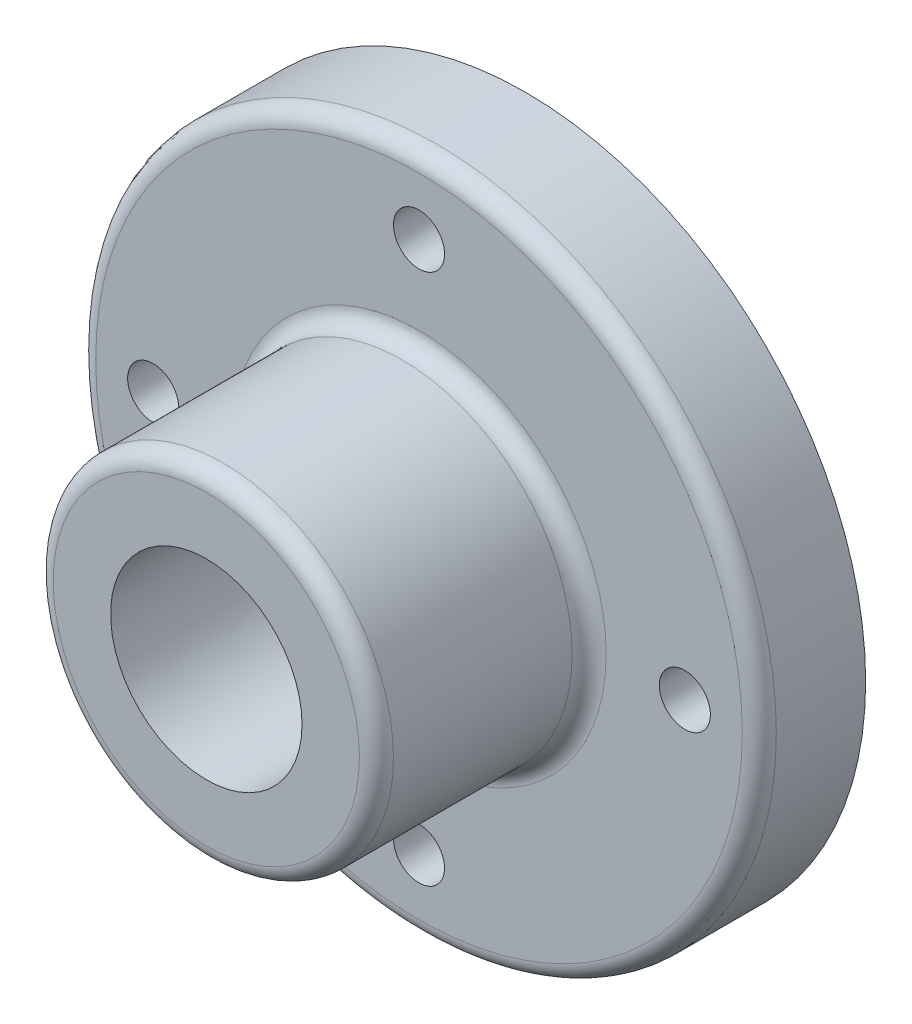
ISO-10303-21;
HEADER;
FILE_DESCRIPTION(('STEP AP214'),'2;1');
FILE_NAME('part.step','',(''),(''),'','','');
FILE_SCHEMA(('AUTOMOTIVE_DESIGN { 1 0 10303 214 1 1 1 1 }'));
ENDSEC;
DATA;
#1=APPLICATION_CONTEXT('core data for automotive mechanical design processes');
#2=APPLICATION_PROTOCOL_DEFINITION('international standard','automotive_design',2000,#1);
#3=PRODUCT_CONTEXT('',#1,'mechanical');
#4=PRODUCT('Part','Part','',(#3));
#5=PRODUCT_RELATED_PRODUCT_CATEGORY('part','',(#4));
#6=PRODUCT_DEFINITION_FORMATION('','',#4);
#7=PRODUCT_DEFINITION_CONTEXT('part definition',#1,'design');
#8=PRODUCT_DEFINITION('design','',#6,#7);
#9=PRODUCT_DEFINITION_SHAPE('','',#8);
#10=(LENGTH_UNIT() NAMED_UNIT(*) SI_UNIT(.MILLI.,.METRE.));
#11=(NAMED_UNIT(*) PLANE_ANGLE_UNIT() SI_UNIT($,.RADIAN.));
#12=(NAMED_UNIT(*) SI_UNIT($,.STERADIAN.) SOLID_ANGLE_UNIT());
#13=UNCERTAINTY_MEASURE_WITH_UNIT(LENGTH_MEASURE(1.E-05),#10,'distance_accuracy_value','');
#14=(GEOMETRIC_REPRESENTATION_CONTEXT(3) GLOBAL_UNCERTAINTY_ASSIGNED_CONTEXT((#13)) GLOBAL_UNIT_ASSIGNED_CONTEXT((#10,
#11,#12)) REPRESENTATION_CONTEXT('',''));
#15=CARTESIAN_POINT('',(0.,0.,0.));
#16=DIRECTION('',(0.,0.,1.));
#17=DIRECTION('',(1.,0.,0.));
#18=AXIS2_PLACEMENT_3D('',#15,#16,#17);
#19=CARTESIAN_POINT('',(0.,0.,25.));
#20=DIRECTION('',(0.,0.,-1.));
#21=DIRECTION('',(-1.,0.,0.));
#22=AXIS2_PLACEMENT_3D('',#19,#20,#21);
#23=CYLINDRICAL_SURFACE('',#22,80.);
#24=CARTESIAN_POINT('',(0.,0.,21.));
#25=DIRECTION('',(0.,0.,1.));
#26=DIRECTION('',(1.,0.,0.));
#27=AXIS2_PLACEMENT_3D('',#24,#25,#26);
#28=CIRCLE('',#27,80.);
#29=CARTESIAN_POINT('',(80.,0.,21.));
#30=VERTEX_POINT('',#29);
#31=EDGE_CURVE('E52',#30,#30,#28,.F.);
#32=ORIENTED_EDGE('',*,*,#31,.T.);
#33=EDGE_LOOP('',(#32));
#34=FACE_BOUND('',#33,.T.);
#35=CARTESIAN_POINT('',(0.,0.,0.));
#36=DIRECTION('',(0.,0.,1.));
#37=DIRECTION('',(1.,0.,0.));
#38=AXIS2_PLACEMENT_3D('',#35,#36,#37);
#39=CIRCLE('',#38,80.);
#40=CARTESIAN_POINT('',(80.,0.,0.));
#41=VERTEX_POINT('',#40);
#42=EDGE_CURVE('E63',#41,#41,#39,.T.);
#43=ORIENTED_EDGE('',*,*,#42,.T.);
#44=EDGE_LOOP('',(#43));
#45=FACE_BOUND('',#44,.T.);
#46=ADVANCED_FACE('F37',(#34,#45),#23,.T.);
#47=CARTESIAN_POINT('',(0.,0.,25.));
#48=DIRECTION('',(0.,0.,1.));
#49=DIRECTION('',(1.,0.,0.));
#50=AXIS2_PLACEMENT_3D('',#47,#48,#49);
#51=PLANE('',#50);
#52=CARTESIAN_POINT('',(0.,0.,25.));
#53=DIRECTION('',(0.,0.,1.));
#54=DIRECTION('',(1.,0.,0.));
#55=AXIS2_PLACEMENT_3D('',#52,#53,#54);
#56=CIRCLE('',#55,76.);
#57=CARTESIAN_POINT('',(76.,0.,25.));
#58=VERTEX_POINT('',#57);
#59=EDGE_CURVE('E57',#58,#58,#56,.T.);
#60=ORIENTED_EDGE('',*,*,#59,.T.);
#61=EDGE_LOOP('',(#60));
#62=FACE_BOUND('',#61,.T.);
#63=CARTESIAN_POINT('',(0.,0.,25.));
#64=DIRECTION('',(0.,0.,1.));
#65=DIRECTION('',(1.,0.,0.));
#66=AXIS2_PLACEMENT_3D('',#63,#64,#65);
#67=CIRCLE('',#66,44.);
#68=CARTESIAN_POINT('',(44.,0.,25.));
#69=VERTEX_POINT('',#68);
#70=EDGE_CURVE('E60',#69,#69,#67,.F.);
#71=ORIENTED_EDGE('',*,*,#70,.T.);
#72=EDGE_LOOP('',(#71));
#73=FACE_BOUND('',#72,.T.);
#74=CARTESIAN_POINT('',(0.,62.5,25.));
#75=DIRECTION('',(0.,0.,1.));
#76=DIRECTION('',(1.,0.,0.));
#77=AXIS2_PLACEMENT_3D('',#74,#75,#76);
#78=CIRCLE('',#77,6.);
#79=CARTESIAN_POINT('',(6.,62.5,25.));
#80=VERTEX_POINT('',#79);
#81=EDGE_CURVE('E86',#80,#80,#78,.T.);
#82=ORIENTED_EDGE('',*,*,#81,.F.);
#83=EDGE_LOOP('',(#82));
#84=FACE_BOUND('',#83,.T.);
#85=CARTESIAN_POINT('',(62.5,0.,25.));
#86=DIRECTION('',(0.,0.,1.));
#87=DIRECTION('',(1.,0.,0.));
#88=AXIS2_PLACEMENT_3D('',#85,#86,#87);
#89=CIRCLE('',#88,6.);
#90=CARTESIAN_POINT('',(68.5,0.,25.));
#91=VERTEX_POINT('',#90);
#92=EDGE_CURVE('E80',#91,#91,#89,.T.);
#93=ORIENTED_EDGE('',*,*,#92,.F.);
#94=EDGE_LOOP('',(#93));
#95=FACE_BOUND('',#94,.T.);
#96=CARTESIAN_POINT('',(0.,-62.5,25.));
#97=DIRECTION('',(0.,0.,1.));
#98=DIRECTION('',(1.,0.,0.));
#99=AXIS2_PLACEMENT_3D('',#96,#97,#98);
#100=CIRCLE('',#99,6.);
#101=CARTESIAN_POINT('',(6.,-62.5,25.));
#102=VERTEX_POINT('',#101);
#103=EDGE_CURVE('E74',#102,#102,#100,.T.);
#104=ORIENTED_EDGE('',*,*,#103,.F.);
#105=EDGE_LOOP('',(#104));
#106=FACE_BOUND('',#105,.T.);
#107=CARTESIAN_POINT('',(-62.5,0.,25.));
#108=DIRECTION('',(0.,0.,1.));
#109=DIRECTION('',(1.,0.,0.));
#110=AXIS2_PLACEMENT_3D('',#107,#108,#109);
#111=CIRCLE('',#110,6.);
#112=CARTESIAN_POINT('',(-56.5,0.,25.));
#113=VERTEX_POINT('',#112);
#114=EDGE_CURVE('E67',#113,#113,#111,.T.);
#115=ORIENTED_EDGE('',*,*,#114,.F.);
#116=EDGE_LOOP('',(#115));
#117=FACE_BOUND('',#116,.T.);
#118=ADVANCED_FACE('F122',(#62,#73,#84,#95,#106,#117),#51,.T.);
#119=CARTESIAN_POINT('',(0.,0.,0.));
#120=DIRECTION('',(0.,0.,1.));
#121=DIRECTION('',(1.,0.,0.));
#122=AXIS2_PLACEMENT_3D('',#119,#120,#121);
#123=PLANE('',#122);
#124=CARTESIAN_POINT('',(0.,0.,0.));
#125=DIRECTION('',(0.,0.,1.));
#126=DIRECTION('',(1.,0.,0.));
#127=AXIS2_PLACEMENT_3D('',#124,#125,#126);
#128=CIRCLE('',#127,22.5);
#129=CARTESIAN_POINT('',(22.5,0.,0.));
#130=VERTEX_POINT('',#129);
#131=EDGE_CURVE('E71',#130,#130,#128,.T.);
#132=ORIENTED_EDGE('',*,*,#131,.T.);
#133=EDGE_LOOP('',(#132));
#134=FACE_BOUND('',#133,.T.);
#135=CARTESIAN_POINT('',(0.,62.5,0.));
#136=DIRECTION('',(0.,0.,1.));
#137=DIRECTION('',(1.,0.,0.));
#138=AXIS2_PLACEMENT_3D('',#135,#136,#137);
#139=CIRCLE('',#138,6.);
#140=CARTESIAN_POINT('',(6.,62.5,0.));
#141=VERTEX_POINT('',#140);
#142=EDGE_CURVE('E66',#141,#141,#139,.T.);
#143=ORIENTED_EDGE('',*,*,#142,.T.);
#144=EDGE_LOOP('',(#143));
#145=FACE_BOUND('',#144,.T.);
#146=CARTESIAN_POINT('',(62.5,0.,0.));
#147=DIRECTION('',(0.,0.,1.));
#148=DIRECTION('',(1.,0.,0.));
#149=AXIS2_PLACEMENT_3D('',#146,#147,#148);
#150=CIRCLE('',#149,6.);
#151=CARTESIAN_POINT('',(68.5,0.,0.));
#152=VERTEX_POINT('',#151);
#153=EDGE_CURVE('E83',#152,#152,#150,.T.);
#154=ORIENTED_EDGE('',*,*,#153,.T.);
#155=EDGE_LOOP('',(#154));
#156=FACE_BOUND('',#155,.T.);
#157=CARTESIAN_POINT('',(0.,-62.5,0.));
#158=DIRECTION('',(0.,0.,1.));
#159=DIRECTION('',(1.,0.,0.));
#160=AXIS2_PLACEMENT_3D('',#157,#158,#159);
#161=CIRCLE('',#160,6.);
#162=CARTESIAN_POINT('',(6.,-62.5,0.));
#163=VERTEX_POINT('',#162);
#164=EDGE_CURVE('E77',#163,#163,#161,.T.);
#165=ORIENTED_EDGE('',*,*,#164,.T.);
#166=EDGE_LOOP('',(#165));
#167=FACE_BOUND('',#166,.T.);
#168=CARTESIAN_POINT('',(-62.5,0.,0.));
#169=DIRECTION('',(0.,0.,1.));
#170=DIRECTION('',(1.,0.,0.));
#171=AXIS2_PLACEMENT_3D('',#168,#169,#170);
#172=CIRCLE('',#171,6.);
#173=CARTESIAN_POINT('',(-56.5,0.,0.));
#174=VERTEX_POINT('',#173);
#175=EDGE_CURVE('E70',#174,#174,#172,.T.);
#176=ORIENTED_EDGE('',*,*,#175,.T.);
#177=EDGE_LOOP('',(#176));
#178=FACE_BOUND('',#177,.T.);
#179=ORIENTED_EDGE('',*,*,#42,.F.);
#180=EDGE_LOOP('',(#179));
#181=FACE_BOUND('',#180,.T.);
#182=ADVANCED_FACE('F97',(#134,#145,#156,#167,#178,#181),#123,.F.);
#183=CARTESIAN_POINT('',(0.,0.,75.));
#184=DIRECTION('',(0.,0.,-1.));
#185=DIRECTION('',(-1.,0.,0.));
#186=AXIS2_PLACEMENT_3D('',#183,#184,#185);
#187=CYLINDRICAL_SURFACE('',#186,40.);
#188=CARTESIAN_POINT('',(0.,0.,29.));
#189=DIRECTION('',(0.,0.,1.));
#190=DIRECTION('',(1.,0.,0.));
#191=AXIS2_PLACEMENT_3D('',#188,#189,#190);
#192=CIRCLE('',#191,40.);
#193=CARTESIAN_POINT('',(40.,0.,29.));
#194=VERTEX_POINT('',#193);
#195=EDGE_CURVE('E44',#194,#194,#192,.T.);
#196=ORIENTED_EDGE('',*,*,#195,.T.);
#197=EDGE_LOOP('',(#196));
#198=FACE_BOUND('',#197,.T.);
#199=CARTESIAN_POINT('',(0.,0.,71.));
#200=DIRECTION('',(0.,0.,1.));
#201=DIRECTION('',(1.,0.,0.));
#202=AXIS2_PLACEMENT_3D('',#199,#200,#201);
#203=CIRCLE('',#202,40.);
#204=CARTESIAN_POINT('',(40.,0.,71.));
#205=VERTEX_POINT('',#204);
#206=EDGE_CURVE('E48',#205,#205,#203,.F.);
#207=ORIENTED_EDGE('',*,*,#206,.T.);
#208=EDGE_LOOP('',(#207));
#209=FACE_BOUND('',#208,.T.);
#210=ADVANCED_FACE('F111',(#198,#209),#187,.T.);
#211=CARTESIAN_POINT('',(0.,0.,75.));
#212=DIRECTION('',(0.,0.,1.));
#213=DIRECTION('',(1.,0.,0.));
#214=AXIS2_PLACEMENT_3D('',#211,#212,#213);
#215=PLANE('',#214);
#216=CARTESIAN_POINT('',(0.,0.,75.));
#217=DIRECTION('',(0.,0.,1.));
#218=DIRECTION('',(1.,0.,0.));
#219=AXIS2_PLACEMENT_3D('',#216,#217,#218);
#220=CIRCLE('',#219,36.);
#221=CARTESIAN_POINT('',(36.,0.,75.));
#222=VERTEX_POINT('',#221);
#223=EDGE_CURVE('E10',#222,#222,#220,.T.);
#224=ORIENTED_EDGE('',*,*,#223,.T.);
#225=EDGE_LOOP('',(#224));
#226=FACE_BOUND('',#225,.T.);
#227=CARTESIAN_POINT('',(0.,0.,75.));
#228=DIRECTION('',(0.,0.,1.));
#229=DIRECTION('',(1.,0.,0.));
#230=AXIS2_PLACEMENT_3D('',#227,#228,#229);
#231=CIRCLE('',#230,22.5);
#232=CARTESIAN_POINT('',(22.5,0.,75.));
#233=VERTEX_POINT('',#232);
#234=EDGE_CURVE('E91',#233,#233,#231,.T.);
#235=ORIENTED_EDGE('',*,*,#234,.F.);
#236=EDGE_LOOP('',(#235));
#237=FACE_BOUND('',#236,.T.);
#238=ADVANCED_FACE('F108',(#226,#237),#215,.T.);
#239=CARTESIAN_POINT('',(-62.5,0.,0.));
#240=DIRECTION('',(0.,0.,1.));
#241=DIRECTION('',(1.,0.,0.));
#242=AXIS2_PLACEMENT_3D('',#239,#240,#241);
#243=CYLINDRICAL_SURFACE('',#242,6.);
#244=ORIENTED_EDGE('',*,*,#175,.F.);
#245=EDGE_LOOP('',(#244));
#246=FACE_BOUND('',#245,.T.);
#247=ORIENTED_EDGE('',*,*,#114,.T.);
#248=EDGE_LOOP('',(#247));
#249=FACE_BOUND('',#248,.T.);
#250=ADVANCED_FACE('F110',(#246,#249),#243,.F.);
#251=CARTESIAN_POINT('',(0.,-62.5,0.));
#252=DIRECTION('',(0.,0.,1.));
#253=DIRECTION('',(1.,0.,0.));
#254=AXIS2_PLACEMENT_3D('',#251,#252,#253);
#255=CYLINDRICAL_SURFACE('',#254,6.);
#256=ORIENTED_EDGE('',*,*,#164,.F.);
#257=EDGE_LOOP('',(#256));
#258=FACE_BOUND('',#257,.T.);
#259=ORIENTED_EDGE('',*,*,#103,.T.);
#260=EDGE_LOOP('',(#259));
#261=FACE_BOUND('',#260,.T.);
#262=ADVANCED_FACE('F117',(#258,#261),#255,.F.);
#263=CARTESIAN_POINT('',(62.5,0.,0.));
#264=DIRECTION('',(0.,0.,1.));
#265=DIRECTION('',(1.,0.,0.));
#266=AXIS2_PLACEMENT_3D('',#263,#264,#265);
#267=CYLINDRICAL_SURFACE('',#266,6.);
#268=ORIENTED_EDGE('',*,*,#153,.F.);
#269=EDGE_LOOP('',(#268));
#270=FACE_BOUND('',#269,.T.);
#271=ORIENTED_EDGE('',*,*,#92,.T.);
#272=EDGE_LOOP('',(#271));
#273=FACE_BOUND('',#272,.T.);
#274=ADVANCED_FACE('F156',(#270,#273),#267,.F.);
#275=CARTESIAN_POINT('',(0.,62.5,0.));
#276=DIRECTION('',(0.,0.,1.));
#277=DIRECTION('',(1.,0.,0.));
#278=AXIS2_PLACEMENT_3D('',#275,#276,#277);
#279=CYLINDRICAL_SURFACE('',#278,6.);
#280=ORIENTED_EDGE('',*,*,#142,.F.);
#281=EDGE_LOOP('',(#280));
#282=FACE_BOUND('',#281,.T.);
#283=ORIENTED_EDGE('',*,*,#81,.T.);
#284=EDGE_LOOP('',(#283));
#285=FACE_BOUND('',#284,.T.);
#286=ADVANCED_FACE('F104',(#282,#285),#279,.F.);
#287=CARTESIAN_POINT('',(0.,0.,0.));
#288=DIRECTION('',(0.,0.,1.));
#289=DIRECTION('',(1.,0.,0.));
#290=AXIS2_PLACEMENT_3D('',#287,#288,#289);
#291=CYLINDRICAL_SURFACE('',#290,22.5);
#292=ORIENTED_EDGE('',*,*,#131,.F.);
#293=EDGE_LOOP('',(#292));
#294=FACE_BOUND('',#293,.T.);
#295=ORIENTED_EDGE('',*,*,#234,.T.);
#296=EDGE_LOOP('',(#295));
#297=FACE_BOUND('',#296,.T.);
#298=ADVANCED_FACE('F100',(#294,#297),#291,.F.);
#299=CARTESIAN_POINT('',(0.,0.,21.));
#300=DIRECTION('',(0.,0.,1.));
#301=DIRECTION('',(1.,0.,0.));
#302=AXIS2_PLACEMENT_3D('',#299,#300,#301);
#303=TOROIDAL_SURFACE('',#302,76.,4.);
#304=ORIENTED_EDGE('',*,*,#31,.F.);
#305=EDGE_LOOP('',(#304));
#306=FACE_BOUND('',#305,.T.);
#307=ORIENTED_EDGE('',*,*,#59,.F.);
#308=EDGE_LOOP('',(#307));
#309=FACE_BOUND('',#308,.T.);
#310=ADVANCED_FACE('F103',(#306,#309),#303,.T.);
#311=CARTESIAN_POINT('',(0.,0.,29.));
#312=DIRECTION('',(0.,0.,1.));
#313=DIRECTION('',(1.,0.,0.));
#314=AXIS2_PLACEMENT_3D('',#311,#312,#313);
#315=TOROIDAL_SURFACE('',#314,44.,4.);
#316=ORIENTED_EDGE('',*,*,#70,.F.);
#317=EDGE_LOOP('',(#316));
#318=FACE_BOUND('',#317,.T.);
#319=ORIENTED_EDGE('',*,*,#195,.F.);
#320=EDGE_LOOP('',(#319));
#321=FACE_BOUND('',#320,.T.);
#322=ADVANCED_FACE('F134',(#318,#321),#315,.F.);
#323=CARTESIAN_POINT('',(0.,0.,71.));
#324=DIRECTION('',(0.,0.,1.));
#325=DIRECTION('',(1.,0.,0.));
#326=AXIS2_PLACEMENT_3D('',#323,#324,#325);
#327=TOROIDAL_SURFACE('',#326,36.,4.);
#328=ORIENTED_EDGE('',*,*,#206,.F.);
#329=EDGE_LOOP('',(#328));
#330=FACE_BOUND('',#329,.T.);
#331=ORIENTED_EDGE('',*,*,#223,.F.);
#332=EDGE_LOOP('',(#331));
#333=FACE_BOUND('',#332,.T.);
#334=ADVANCED_FACE('F39',(#330,#333),#327,.T.);
#335=CLOSED_SHELL('',(#46,#118,#182,#210,#238,#250,#262,#274,#286,#298,#310,#322,#334));
#336=MANIFOLD_SOLID_BREP('B2',#335);
#337=ADVANCED_BREP_SHAPE_REPRESENTATION('',(#18,#336),#14);
#338=SHAPE_DEFINITION_REPRESENTATION(#9,#337);
ENDSEC;
END-ISO-10303-21;
